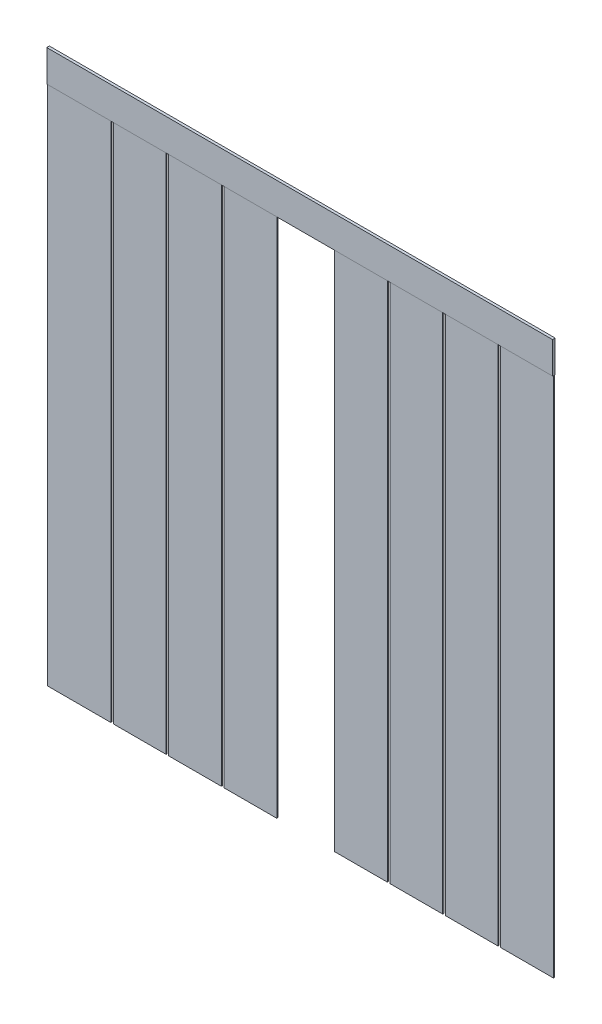
ISO-10303-21;
HEADER;
FILE_DESCRIPTION(('STEP AP214'),'2;1');
FILE_NAME('part.step','',(''),(''),'','','');
FILE_SCHEMA(('AUTOMOTIVE_DESIGN { 1 0 10303 214 1 1 1 1 }'));
ENDSEC;
DATA;
#1=APPLICATION_CONTEXT('core data for automotive mechanical design processes');
#2=APPLICATION_PROTOCOL_DEFINITION('international standard','automotive_design',2000,#1);
#3=PRODUCT_CONTEXT('',#1,'mechanical');
#4=PRODUCT('Part','Part','',(#3));
#5=PRODUCT_RELATED_PRODUCT_CATEGORY('part','',(#4));
#6=PRODUCT_DEFINITION_FORMATION('','',#4);
#7=PRODUCT_DEFINITION_CONTEXT('part definition',#1,'design');
#8=PRODUCT_DEFINITION('design','',#6,#7);
#9=PRODUCT_DEFINITION_SHAPE('','',#8);
#10=(LENGTH_UNIT() NAMED_UNIT(*) SI_UNIT(.MILLI.,.METRE.));
#11=(NAMED_UNIT(*) PLANE_ANGLE_UNIT() SI_UNIT($,.RADIAN.));
#12=(NAMED_UNIT(*) SI_UNIT($,.STERADIAN.) SOLID_ANGLE_UNIT());
#13=UNCERTAINTY_MEASURE_WITH_UNIT(LENGTH_MEASURE(1.E-05),#10,'distance_accuracy_value','');
#14=(GEOMETRIC_REPRESENTATION_CONTEXT(3) GLOBAL_UNCERTAINTY_ASSIGNED_CONTEXT((#13)) GLOBAL_UNIT_ASSIGNED_CONTEXT((#10,
#11,#12)) REPRESENTATION_CONTEXT('',''));
#15=CARTESIAN_POINT('',(0.,0.,0.));
#16=DIRECTION('',(0.,0.,1.));
#17=DIRECTION('',(1.,0.,0.));
#18=AXIS2_PLACEMENT_3D('',#15,#16,#17);
#19=CARTESIAN_POINT('',(2.57175827820944E-13,-2100.,10.));
#20=DIRECTION('',(0.,1.,0.));
#21=DIRECTION('',(0.,0.,1.));
#22=AXIS2_PLACEMENT_3D('',#19,#20,#21);
#23=PLANE('',#22);
#24=DIRECTION('',(1.,0.,0.));
#25=VECTOR('',#24,1.);
#26=CARTESIAN_POINT('',(2.57175827820944E-13,-2100.,7.));
#27=LINE('',#26,#25);
#28=CARTESIAN_POINT('',(1300.,-2100.,7.));
#29=VERTEX_POINT('',#28);
#30=CARTESIAN_POINT('',(1500.,-2100.,7.));
#31=VERTEX_POINT('',#30);
#32=EDGE_CURVE('E287',#29,#31,#27,.T.);
#33=ORIENTED_EDGE('',*,*,#32,.F.);
#34=DIRECTION('',(0.,0.,-1.));
#35=VECTOR('',#34,1.);
#36=CARTESIAN_POINT('',(1300.,-2100.,11.));
#37=LINE('',#36,#35);
#38=CARTESIAN_POINT('',(1300.,-2100.,3.));
#39=VERTEX_POINT('',#38);
#40=EDGE_CURVE('E272',#29,#39,#37,.T.);
#41=ORIENTED_EDGE('',*,*,#40,.T.);
#42=DIRECTION('',(-1.,0.,0.));
#43=VECTOR('',#42,1.);
#44=CARTESIAN_POINT('',(1920.,-2100.,3.));
#45=LINE('',#44,#43);
#46=CARTESIAN_POINT('',(1500.,-2100.,3.));
#47=VERTEX_POINT('',#46);
#48=EDGE_CURVE('E286',#47,#39,#45,.T.);
#49=ORIENTED_EDGE('',*,*,#48,.F.);
#50=DIRECTION('',(0.,0.,-1.));
#51=VECTOR('',#50,1.);
#52=CARTESIAN_POINT('',(1500.,-2100.,11.));
#53=LINE('',#52,#51);
#54=EDGE_CURVE('E489',#31,#47,#53,.T.);
#55=ORIENTED_EDGE('',*,*,#54,.F.);
#56=EDGE_LOOP('',(#33,#41,#49,#55));
#57=FACE_BOUND('',#56,.T.);
#58=ADVANCED_FACE('F35',(#57),#23,.F.);
#59=CARTESIAN_POINT('',(1290.,-2100.,3.));
#60=VERTEX_POINT('',#59);
#61=CARTESIAN_POINT('',(1090.,-2100.,3.));
#62=VERTEX_POINT('',#61);
#63=EDGE_CURVE('E295',#60,#62,#45,.T.);
#64=ORIENTED_EDGE('',*,*,#63,.F.);
#65=DIRECTION('',(0.,0.,-1.));
#66=VECTOR('',#65,1.);
#67=CARTESIAN_POINT('',(1290.,-2100.,11.));
#68=LINE('',#67,#66);
#69=CARTESIAN_POINT('',(1290.,-2100.,7.));
#70=VERTEX_POINT('',#69);
#71=EDGE_CURVE('E288',#70,#60,#68,.T.);
#72=ORIENTED_EDGE('',*,*,#71,.F.);
#73=CARTESIAN_POINT('',(1090.,-2100.,7.));
#74=VERTEX_POINT('',#73);
#75=EDGE_CURVE('E652',#74,#70,#27,.T.);
#76=ORIENTED_EDGE('',*,*,#75,.F.);
#77=DIRECTION('',(0.,0.,-1.));
#78=VECTOR('',#77,1.);
#79=CARTESIAN_POINT('',(1090.,-2100.,11.));
#80=LINE('',#79,#78);
#81=EDGE_CURVE('E558',#74,#62,#80,.T.);
#82=ORIENTED_EDGE('',*,*,#81,.T.);
#83=EDGE_LOOP('',(#64,#72,#76,#82));
#84=FACE_BOUND('',#83,.T.);
#85=ADVANCED_FACE('F614',(#84),#23,.F.);
#86=CARTESIAN_POINT('',(870.,-2100.,3.));
#87=VERTEX_POINT('',#86);
#88=CARTESIAN_POINT('',(670.,-2100.,3.));
#89=VERTEX_POINT('',#88);
#90=EDGE_CURVE('E300',#87,#89,#45,.T.);
#91=ORIENTED_EDGE('',*,*,#90,.F.);
#92=DIRECTION('',(0.,0.,-1.));
#93=VECTOR('',#92,1.);
#94=CARTESIAN_POINT('',(870.,-2100.,11.));
#95=LINE('',#94,#93);
#96=CARTESIAN_POINT('',(870.,-2100.,7.));
#97=VERTEX_POINT('',#96);
#98=EDGE_CURVE('E412',#97,#87,#95,.T.);
#99=ORIENTED_EDGE('',*,*,#98,.F.);
#100=CARTESIAN_POINT('',(670.,-2100.,7.));
#101=VERTEX_POINT('',#100);
#102=EDGE_CURVE('E415',#101,#97,#27,.T.);
#103=ORIENTED_EDGE('',*,*,#102,.F.);
#104=DIRECTION('',(0.,0.,-1.));
#105=VECTOR('',#104,1.);
#106=CARTESIAN_POINT('',(670.,-2100.,11.));
#107=LINE('',#106,#105);
#108=EDGE_CURVE('E414',#101,#89,#107,.T.);
#109=ORIENTED_EDGE('',*,*,#108,.T.);
#110=EDGE_LOOP('',(#91,#99,#103,#109));
#111=FACE_BOUND('',#110,.T.);
#112=ADVANCED_FACE('F410',(#111),#23,.F.);
#113=CARTESIAN_POINT('',(660.,-2100.,3.));
#114=VERTEX_POINT('',#113);
#115=CARTESIAN_POINT('',(460.,-2100.,3.));
#116=VERTEX_POINT('',#115);
#117=EDGE_CURVE('E387',#114,#116,#45,.T.);
#118=ORIENTED_EDGE('',*,*,#117,.F.);
#119=DIRECTION('',(0.,0.,-1.));
#120=VECTOR('',#119,1.);
#121=CARTESIAN_POINT('',(660.,-2100.,11.));
#122=LINE('',#121,#120);
#123=CARTESIAN_POINT('',(660.,-2100.,7.));
#124=VERTEX_POINT('',#123);
#125=EDGE_CURVE('E418',#124,#114,#122,.T.);
#126=ORIENTED_EDGE('',*,*,#125,.F.);
#127=CARTESIAN_POINT('',(460.,-2100.,7.));
#128=VERTEX_POINT('',#127);
#129=EDGE_CURVE('E582',#128,#124,#27,.T.);
#130=ORIENTED_EDGE('',*,*,#129,.F.);
#131=DIRECTION('',(0.,0.,-1.));
#132=VECTOR('',#131,1.);
#133=CARTESIAN_POINT('',(460.,-2100.,11.));
#134=LINE('',#133,#132);
#135=EDGE_CURVE('E432',#128,#116,#134,.T.);
#136=ORIENTED_EDGE('',*,*,#135,.T.);
#137=EDGE_LOOP('',(#118,#126,#130,#136));
#138=FACE_BOUND('',#137,.T.);
#139=ADVANCED_FACE('F579',(#138),#23,.F.);
#140=CARTESIAN_POINT('',(450.,-2100.,3.));
#141=VERTEX_POINT('',#140);
#142=CARTESIAN_POINT('',(250.,-2100.,3.));
#143=VERTEX_POINT('',#142);
#144=EDGE_CURVE('E382',#141,#143,#45,.T.);
#145=ORIENTED_EDGE('',*,*,#144,.F.);
#146=DIRECTION('',(0.,0.,-1.));
#147=VECTOR('',#146,1.);
#148=CARTESIAN_POINT('',(450.,-2100.,11.));
#149=LINE('',#148,#147);
#150=CARTESIAN_POINT('',(450.,-2100.,7.));
#151=VERTEX_POINT('',#150);
#152=EDGE_CURVE('E58',#151,#141,#149,.T.);
#153=ORIENTED_EDGE('',*,*,#152,.F.);
#154=CARTESIAN_POINT('',(250.,-2100.,7.));
#155=VERTEX_POINT('',#154);
#156=EDGE_CURVE('E331',#155,#151,#27,.T.);
#157=ORIENTED_EDGE('',*,*,#156,.F.);
#158=DIRECTION('',(0.,0.,-1.));
#159=VECTOR('',#158,1.);
#160=CARTESIAN_POINT('',(250.,-2100.,11.));
#161=LINE('',#160,#159);
#162=EDGE_CURVE('E444',#155,#143,#161,.T.);
#163=ORIENTED_EDGE('',*,*,#162,.T.);
#164=EDGE_LOOP('',(#145,#153,#157,#163));
#165=FACE_BOUND('',#164,.T.);
#166=ADVANCED_FACE('F628',(#165),#23,.F.);
#167=CARTESIAN_POINT('',(0.,0.,7.));
#168=DIRECTION('',(0.,0.,-1.));
#169=DIRECTION('',(-1.,0.,0.));
#170=AXIS2_PLACEMENT_3D('',#167,#168,#169);
#171=PLANE('',#170);
#172=DIRECTION('',(-1.,0.,0.));
#173=VECTOR('',#172,1.);
#174=CARTESIAN_POINT('',(0.,-120.,7.));
#175=LINE('',#174,#173);
#176=CARTESIAN_POINT('',(1500.,-120.,7.));
#177=VERTEX_POINT('',#176);
#178=CARTESIAN_POINT('',(1300.,-120.,7.));
#179=VERTEX_POINT('',#178);
#180=EDGE_CURVE('E1040',#177,#179,#175,.T.);
#181=ORIENTED_EDGE('',*,*,#180,.T.);
#182=DIRECTION('',(0.,-1.,0.));
#183=VECTOR('',#182,1.);
#184=CARTESIAN_POINT('',(1300.,0.,7.));
#185=LINE('',#184,#183);
#186=EDGE_CURVE('E477',#179,#29,#185,.T.);
#187=ORIENTED_EDGE('',*,*,#186,.T.);
#188=ORIENTED_EDGE('',*,*,#32,.T.);
#189=DIRECTION('',(0.,1.,0.));
#190=VECTOR('',#189,1.);
#191=CARTESIAN_POINT('',(1500.,0.,7.));
#192=LINE('',#191,#190);
#193=EDGE_CURVE('E485',#31,#177,#192,.T.);
#194=ORIENTED_EDGE('',*,*,#193,.T.);
#195=EDGE_LOOP('',(#181,#187,#188,#194));
#196=FACE_BOUND('',#195,.T.);
#197=ADVANCED_FACE('F637',(#196),#171,.F.);
#198=ORIENTED_EDGE('',*,*,#75,.T.);
#199=DIRECTION('',(0.,1.,0.));
#200=VECTOR('',#199,1.);
#201=CARTESIAN_POINT('',(1290.,0.,7.));
#202=LINE('',#201,#200);
#203=CARTESIAN_POINT('',(1290.,-120.,7.));
#204=VERTEX_POINT('',#203);
#205=EDGE_CURVE('E474',#70,#204,#202,.T.);
#206=ORIENTED_EDGE('',*,*,#205,.T.);
#207=CARTESIAN_POINT('',(1090.,-120.,7.));
#208=VERTEX_POINT('',#207);
#209=EDGE_CURVE('E548',#204,#208,#175,.T.);
#210=ORIENTED_EDGE('',*,*,#209,.T.);
#211=DIRECTION('',(0.,-1.,0.));
#212=VECTOR('',#211,1.);
#213=CARTESIAN_POINT('',(1090.,0.,7.));
#214=LINE('',#213,#212);
#215=EDGE_CURVE('E471',#208,#74,#214,.T.);
#216=ORIENTED_EDGE('',*,*,#215,.T.);
#217=EDGE_LOOP('',(#198,#206,#210,#216));
#218=FACE_BOUND('',#217,.T.);
#219=ADVANCED_FACE('F643',(#218),#171,.F.);
#220=ORIENTED_EDGE('',*,*,#102,.T.);
#221=DIRECTION('',(0.,1.,0.));
#222=VECTOR('',#221,1.);
#223=CARTESIAN_POINT('',(870.,0.,7.));
#224=LINE('',#223,#222);
#225=CARTESIAN_POINT('',(870.,-120.,7.));
#226=VERTEX_POINT('',#225);
#227=EDGE_CURVE('E468',#97,#226,#224,.T.);
#228=ORIENTED_EDGE('',*,*,#227,.T.);
#229=CARTESIAN_POINT('',(670.,-120.,7.));
#230=VERTEX_POINT('',#229);
#231=EDGE_CURVE('E587',#226,#230,#175,.T.);
#232=ORIENTED_EDGE('',*,*,#231,.T.);
#233=DIRECTION('',(0.,-1.,0.));
#234=VECTOR('',#233,1.);
#235=CARTESIAN_POINT('',(670.,0.,7.));
#236=LINE('',#235,#234);
#237=EDGE_CURVE('E466',#230,#101,#236,.T.);
#238=ORIENTED_EDGE('',*,*,#237,.T.);
#239=EDGE_LOOP('',(#220,#228,#232,#238));
#240=FACE_BOUND('',#239,.T.);
#241=ADVANCED_FACE('F658',(#240),#171,.F.);
#242=ORIENTED_EDGE('',*,*,#129,.T.);
#243=DIRECTION('',(0.,1.,0.));
#244=VECTOR('',#243,1.);
#245=CARTESIAN_POINT('',(660.,0.,7.));
#246=LINE('',#245,#244);
#247=CARTESIAN_POINT('',(660.,-120.,7.));
#248=VERTEX_POINT('',#247);
#249=EDGE_CURVE('E463',#124,#248,#246,.T.);
#250=ORIENTED_EDGE('',*,*,#249,.T.);
#251=CARTESIAN_POINT('',(460.,-120.,7.));
#252=VERTEX_POINT('',#251);
#253=EDGE_CURVE('E573',#248,#252,#175,.T.);
#254=ORIENTED_EDGE('',*,*,#253,.T.);
#255=DIRECTION('',(0.,-1.,0.));
#256=VECTOR('',#255,1.);
#257=CARTESIAN_POINT('',(460.,0.,7.));
#258=LINE('',#257,#256);
#259=EDGE_CURVE('E460',#252,#128,#258,.T.);
#260=ORIENTED_EDGE('',*,*,#259,.T.);
#261=EDGE_LOOP('',(#242,#250,#254,#260));
#262=FACE_BOUND('',#261,.T.);
#263=ADVANCED_FACE('F586',(#262),#171,.F.);
#264=ORIENTED_EDGE('',*,*,#156,.T.);
#265=DIRECTION('',(0.,1.,0.));
#266=VECTOR('',#265,1.);
#267=CARTESIAN_POINT('',(450.,0.,7.));
#268=LINE('',#267,#266);
#269=CARTESIAN_POINT('',(450.,-120.,7.));
#270=VERTEX_POINT('',#269);
#271=EDGE_CURVE('E457',#151,#270,#268,.T.);
#272=ORIENTED_EDGE('',*,*,#271,.T.);
#273=CARTESIAN_POINT('',(250.,-120.,7.));
#274=VERTEX_POINT('',#273);
#275=EDGE_CURVE('E588',#270,#274,#175,.T.);
#276=ORIENTED_EDGE('',*,*,#275,.T.);
#277=DIRECTION('',(0.,-1.,0.));
#278=VECTOR('',#277,1.);
#279=CARTESIAN_POINT('',(250.,0.,7.));
#280=LINE('',#279,#278);
#281=EDGE_CURVE('E454',#274,#155,#280,.T.);
#282=ORIENTED_EDGE('',*,*,#281,.T.);
#283=EDGE_LOOP('',(#264,#272,#276,#282));
#284=FACE_BOUND('',#283,.T.);
#285=ADVANCED_FACE('F634',(#284),#171,.F.);
#286=CARTESIAN_POINT('',(0.,0.,3.));
#287=DIRECTION('',(0.,0.,1.));
#288=DIRECTION('',(1.,0.,0.));
#289=AXIS2_PLACEMENT_3D('',#286,#287,#288);
#290=PLANE('',#289);
#291=ORIENTED_EDGE('',*,*,#48,.T.);
#292=DIRECTION('',(0.,-1.,0.));
#293=VECTOR('',#292,1.);
#294=CARTESIAN_POINT('',(1300.,-2100.,3.));
#295=LINE('',#294,#293);
#296=CARTESIAN_POINT('',(1300.,-120.,3.));
#297=VERTEX_POINT('',#296);
#298=EDGE_CURVE('E269',#297,#39,#295,.T.);
#299=ORIENTED_EDGE('',*,*,#298,.F.);
#300=DIRECTION('',(1.,0.,0.));
#301=VECTOR('',#300,1.);
#302=CARTESIAN_POINT('',(1920.,-120.,3.));
#303=LINE('',#302,#301);
#304=CARTESIAN_POINT('',(1500.,-120.,3.));
#305=VERTEX_POINT('',#304);
#306=EDGE_CURVE('E315',#297,#305,#303,.T.);
#307=ORIENTED_EDGE('',*,*,#306,.T.);
#308=DIRECTION('',(0.,1.,0.));
#309=VECTOR('',#308,1.);
#310=CARTESIAN_POINT('',(1500.,-2100.,3.));
#311=LINE('',#310,#309);
#312=EDGE_CURVE('E293',#47,#305,#311,.T.);
#313=ORIENTED_EDGE('',*,*,#312,.F.);
#314=EDGE_LOOP('',(#291,#299,#307,#313));
#315=FACE_BOUND('',#314,.T.);
#316=ADVANCED_FACE('F291',(#315),#290,.F.);
#317=CARTESIAN_POINT('',(1090.,-120.,3.));
#318=VERTEX_POINT('',#317);
#319=CARTESIAN_POINT('',(1290.,-120.,3.));
#320=VERTEX_POINT('',#319);
#321=EDGE_CURVE('E527',#318,#320,#303,.T.);
#322=ORIENTED_EDGE('',*,*,#321,.T.);
#323=DIRECTION('',(0.,1.,0.));
#324=VECTOR('',#323,1.);
#325=CARTESIAN_POINT('',(1290.,-2100.,3.));
#326=LINE('',#325,#324);
#327=EDGE_CURVE('E279',#60,#320,#326,.T.);
#328=ORIENTED_EDGE('',*,*,#327,.F.);
#329=ORIENTED_EDGE('',*,*,#63,.T.);
#330=DIRECTION('',(0.,-1.,0.));
#331=VECTOR('',#330,1.);
#332=CARTESIAN_POINT('',(1090.,-2100.,3.));
#333=LINE('',#332,#331);
#334=EDGE_CURVE('E542',#318,#62,#333,.T.);
#335=ORIENTED_EDGE('',*,*,#334,.F.);
#336=EDGE_LOOP('',(#322,#328,#329,#335));
#337=FACE_BOUND('',#336,.T.);
#338=ADVANCED_FACE('F539',(#337),#290,.F.);
#339=CARTESIAN_POINT('',(670.,-120.,3.));
#340=VERTEX_POINT('',#339);
#341=CARTESIAN_POINT('',(870.,-120.,3.));
#342=VERTEX_POINT('',#341);
#343=EDGE_CURVE('E532',#340,#342,#303,.T.);
#344=ORIENTED_EDGE('',*,*,#343,.T.);
#345=DIRECTION('',(0.,1.,0.));
#346=VECTOR('',#345,1.);
#347=CARTESIAN_POINT('',(870.,-2100.,3.));
#348=LINE('',#347,#346);
#349=EDGE_CURVE('E406',#87,#342,#348,.T.);
#350=ORIENTED_EDGE('',*,*,#349,.F.);
#351=ORIENTED_EDGE('',*,*,#90,.T.);
#352=DIRECTION('',(0.,-1.,0.));
#353=VECTOR('',#352,1.);
#354=CARTESIAN_POINT('',(670.,-2100.,3.));
#355=LINE('',#354,#353);
#356=EDGE_CURVE('E403',#340,#89,#355,.T.);
#357=ORIENTED_EDGE('',*,*,#356,.F.);
#358=EDGE_LOOP('',(#344,#350,#351,#357));
#359=FACE_BOUND('',#358,.T.);
#360=ADVANCED_FACE('F402',(#359),#290,.F.);
#361=CARTESIAN_POINT('',(460.,-120.,3.));
#362=VERTEX_POINT('',#361);
#363=CARTESIAN_POINT('',(660.,-120.,3.));
#364=VERTEX_POINT('',#363);
#365=EDGE_CURVE('E529',#362,#364,#303,.T.);
#366=ORIENTED_EDGE('',*,*,#365,.T.);
#367=DIRECTION('',(0.,1.,0.));
#368=VECTOR('',#367,1.);
#369=CARTESIAN_POINT('',(660.,-2100.,3.));
#370=LINE('',#369,#368);
#371=EDGE_CURVE('E419',#114,#364,#370,.T.);
#372=ORIENTED_EDGE('',*,*,#371,.F.);
#373=ORIENTED_EDGE('',*,*,#117,.T.);
#374=DIRECTION('',(0.,-1.,0.));
#375=VECTOR('',#374,1.);
#376=CARTESIAN_POINT('',(460.,-2100.,3.));
#377=LINE('',#376,#375);
#378=EDGE_CURVE('E427',#362,#116,#377,.T.);
#379=ORIENTED_EDGE('',*,*,#378,.F.);
#380=EDGE_LOOP('',(#366,#372,#373,#379));
#381=FACE_BOUND('',#380,.T.);
#382=ADVANCED_FACE('F577',(#381),#290,.F.);
#383=CARTESIAN_POINT('',(250.,-120.,3.));
#384=VERTEX_POINT('',#383);
#385=CARTESIAN_POINT('',(450.,-120.,3.));
#386=VERTEX_POINT('',#385);
#387=EDGE_CURVE('E314',#384,#386,#303,.T.);
#388=ORIENTED_EDGE('',*,*,#387,.T.);
#389=DIRECTION('',(0.,1.,0.));
#390=VECTOR('',#389,1.);
#391=CARTESIAN_POINT('',(450.,-2100.,3.));
#392=LINE('',#391,#390);
#393=EDGE_CURVE('E429',#141,#386,#392,.T.);
#394=ORIENTED_EDGE('',*,*,#393,.F.);
#395=ORIENTED_EDGE('',*,*,#144,.T.);
#396=DIRECTION('',(0.,-1.,0.));
#397=VECTOR('',#396,1.);
#398=CARTESIAN_POINT('',(250.,-2100.,3.));
#399=LINE('',#398,#397);
#400=EDGE_CURVE('E440',#384,#143,#399,.T.);
#401=ORIENTED_EDGE('',*,*,#400,.F.);
#402=EDGE_LOOP('',(#388,#394,#395,#401));
#403=FACE_BOUND('',#402,.T.);
#404=ADVANCED_FACE('F625',(#403),#290,.F.);
#405=CARTESIAN_POINT('',(1510.,-2100.,7.));
#406=VERTEX_POINT('',#405);
#407=CARTESIAN_POINT('',(1710.,-2100.,7.));
#408=VERTEX_POINT('',#407);
#409=EDGE_CURVE('E650',#406,#408,#27,.T.);
#410=ORIENTED_EDGE('',*,*,#409,.F.);
#411=DIRECTION('',(0.,0.,-1.));
#412=VECTOR('',#411,1.);
#413=CARTESIAN_POINT('',(1510.,-2100.,11.));
#414=LINE('',#413,#412);
#415=CARTESIAN_POINT('',(1510.,-2100.,3.));
#416=VERTEX_POINT('',#415);
#417=EDGE_CURVE('E482',#406,#416,#414,.T.);
#418=ORIENTED_EDGE('',*,*,#417,.T.);
#419=CARTESIAN_POINT('',(1710.,-2100.,3.));
#420=VERTEX_POINT('',#419);
#421=EDGE_CURVE('E294',#420,#416,#45,.T.);
#422=ORIENTED_EDGE('',*,*,#421,.F.);
#423=DIRECTION('',(0.,0.,-1.));
#424=VECTOR('',#423,1.);
#425=CARTESIAN_POINT('',(1710.,-2100.,11.));
#426=LINE('',#425,#424);
#427=EDGE_CURVE('E508',#408,#420,#426,.T.);
#428=ORIENTED_EDGE('',*,*,#427,.F.);
#429=EDGE_LOOP('',(#410,#418,#422,#428));
#430=FACE_BOUND('',#429,.T.);
#431=ADVANCED_FACE('F617',(#430),#23,.F.);
#432=CARTESIAN_POINT('',(1710.,-120.,7.));
#433=VERTEX_POINT('',#432);
#434=CARTESIAN_POINT('',(1510.,-120.,7.));
#435=VERTEX_POINT('',#434);
#436=EDGE_CURVE('E338',#433,#435,#175,.T.);
#437=ORIENTED_EDGE('',*,*,#436,.T.);
#438=DIRECTION('',(0.,-1.,0.));
#439=VECTOR('',#438,1.);
#440=CARTESIAN_POINT('',(1510.,0.,7.));
#441=LINE('',#440,#439);
#442=EDGE_CURVE('E495',#435,#406,#441,.T.);
#443=ORIENTED_EDGE('',*,*,#442,.T.);
#444=ORIENTED_EDGE('',*,*,#409,.T.);
#445=DIRECTION('',(0.,1.,0.));
#446=VECTOR('',#445,1.);
#447=CARTESIAN_POINT('',(1710.,0.,7.));
#448=LINE('',#447,#446);
#449=EDGE_CURVE('E504',#408,#433,#448,.T.);
#450=ORIENTED_EDGE('',*,*,#449,.T.);
#451=EDGE_LOOP('',(#437,#443,#444,#450));
#452=FACE_BOUND('',#451,.T.);
#453=ADVANCED_FACE('F623',(#452),#171,.F.);
#454=ORIENTED_EDGE('',*,*,#421,.T.);
#455=DIRECTION('',(0.,-1.,0.));
#456=VECTOR('',#455,1.);
#457=CARTESIAN_POINT('',(1510.,-2100.,3.));
#458=LINE('',#457,#456);
#459=CARTESIAN_POINT('',(1510.,-120.,3.));
#460=VERTEX_POINT('',#459);
#461=EDGE_CURVE('E479',#460,#416,#458,.T.);
#462=ORIENTED_EDGE('',*,*,#461,.F.);
#463=CARTESIAN_POINT('',(1710.,-120.,3.));
#464=VERTEX_POINT('',#463);
#465=EDGE_CURVE('E522',#460,#464,#303,.T.);
#466=ORIENTED_EDGE('',*,*,#465,.T.);
#467=DIRECTION('',(0.,1.,0.));
#468=VECTOR('',#467,1.);
#469=CARTESIAN_POINT('',(1710.,-2100.,3.));
#470=LINE('',#469,#468);
#471=EDGE_CURVE('E499',#420,#464,#470,.T.);
#472=ORIENTED_EDGE('',*,*,#471,.F.);
#473=EDGE_LOOP('',(#454,#462,#466,#472));
#474=FACE_BOUND('',#473,.T.);
#475=ADVANCED_FACE('F616',(#474),#290,.F.);
#476=CARTESIAN_POINT('',(1720.,-2100.,7.));
#477=VERTEX_POINT('',#476);
#478=CARTESIAN_POINT('',(1920.,-2100.,7.));
#479=VERTEX_POINT('',#478);
#480=EDGE_CURVE('E326',#477,#479,#27,.T.);
#481=ORIENTED_EDGE('',*,*,#480,.F.);
#482=DIRECTION('',(0.,0.,-1.));
#483=VECTOR('',#482,1.);
#484=CARTESIAN_POINT('',(1720.,-2100.,11.));
#485=LINE('',#484,#483);
#486=CARTESIAN_POINT('',(1720.,-2100.,3.));
#487=VERTEX_POINT('',#486);
#488=EDGE_CURVE('E375',#477,#487,#485,.T.);
#489=ORIENTED_EDGE('',*,*,#488,.T.);
#490=CARTESIAN_POINT('',(1920.,-2100.,3.));
#491=VERTEX_POINT('',#490);
#492=EDGE_CURVE('E298',#491,#487,#45,.T.);
#493=ORIENTED_EDGE('',*,*,#492,.F.);
#494=DIRECTION('',(0.,0.,-1.));
#495=VECTOR('',#494,1.);
#496=CARTESIAN_POINT('',(1920.,-2100.,10.));
#497=LINE('',#496,#495);
#498=EDGE_CURVE('E43',#479,#491,#497,.T.);
#499=ORIENTED_EDGE('',*,*,#498,.F.);
#500=EDGE_LOOP('',(#481,#489,#493,#499));
#501=FACE_BOUND('',#500,.T.);
#502=ADVANCED_FACE('F373',(#501),#23,.F.);
#503=CARTESIAN_POINT('',(1920.,-120.,7.));
#504=VERTEX_POINT('',#503);
#505=CARTESIAN_POINT('',(1720.,-120.,7.));
#506=VERTEX_POINT('',#505);
#507=EDGE_CURVE('E334',#504,#506,#175,.T.);
#508=ORIENTED_EDGE('',*,*,#507,.T.);
#509=DIRECTION('',(0.,-1.,0.));
#510=VECTOR('',#509,1.);
#511=CARTESIAN_POINT('',(1720.,0.,7.));
#512=LINE('',#511,#510);
#513=EDGE_CURVE('E318',#506,#477,#512,.T.);
#514=ORIENTED_EDGE('',*,*,#513,.T.);
#515=ORIENTED_EDGE('',*,*,#480,.T.);
#516=DIRECTION('',(0.,1.,0.));
#517=VECTOR('',#516,1.);
#518=CARTESIAN_POINT('',(1920.,-2100.,7.));
#519=LINE('',#518,#517);
#520=EDGE_CURVE('E330',#479,#504,#519,.T.);
#521=ORIENTED_EDGE('',*,*,#520,.T.);
#522=EDGE_LOOP('',(#508,#514,#515,#521));
#523=FACE_BOUND('',#522,.T.);
#524=ADVANCED_FACE('F514',(#523),#171,.F.);
#525=ORIENTED_EDGE('',*,*,#492,.T.);
#526=DIRECTION('',(0.,-1.,0.));
#527=VECTOR('',#526,1.);
#528=CARTESIAN_POINT('',(1720.,-2100.,3.));
#529=LINE('',#528,#527);
#530=CARTESIAN_POINT('',(1720.,-120.,3.));
#531=VERTEX_POINT('',#530);
#532=EDGE_CURVE('E379',#531,#487,#529,.T.);
#533=ORIENTED_EDGE('',*,*,#532,.F.);
#534=CARTESIAN_POINT('',(1920.,-120.,3.));
#535=VERTEX_POINT('',#534);
#536=EDGE_CURVE('E309',#531,#535,#303,.T.);
#537=ORIENTED_EDGE('',*,*,#536,.T.);
#538=DIRECTION('',(0.,-1.,0.));
#539=VECTOR('',#538,1.);
#540=CARTESIAN_POINT('',(1920.,-2100.,3.));
#541=LINE('',#540,#539);
#542=EDGE_CURVE('E306',#535,#491,#541,.T.);
#543=ORIENTED_EDGE('',*,*,#542,.T.);
#544=EDGE_LOOP('',(#525,#533,#537,#543));
#545=FACE_BOUND('',#544,.T.);
#546=ADVANCED_FACE('F378',(#545),#290,.F.);
#547=CARTESIAN_POINT('',(0.,0.,10.));
#548=DIRECTION('',(1.,0.,0.));
#549=DIRECTION('',(0.,1.,0.));
#550=AXIS2_PLACEMENT_3D('',#547,#548,#549);
#551=PLANE('',#550);
#552=DIRECTION('',(0.,-1.,0.));
#553=VECTOR('',#552,1.);
#554=CARTESIAN_POINT('',(0.,0.,0.));
#555=LINE('',#554,#553);
#556=CARTESIAN_POINT('',(0.,0.,0.));
#557=VERTEX_POINT('',#556);
#558=CARTESIAN_POINT('',(0.,-120.,0.));
#559=VERTEX_POINT('',#558);
#560=EDGE_CURVE('E343',#557,#559,#555,.T.);
#561=ORIENTED_EDGE('',*,*,#560,.T.);
#562=DIRECTION('',(0.,0.,-1.));
#563=VECTOR('',#562,1.);
#564=CARTESIAN_POINT('',(0.,-120.,3.));
#565=LINE('',#564,#563);
#566=CARTESIAN_POINT('',(0.,-120.,3.));
#567=VERTEX_POINT('',#566);
#568=EDGE_CURVE('E313',#567,#559,#565,.T.);
#569=ORIENTED_EDGE('',*,*,#568,.F.);
#570=DIRECTION('',(0.,1.,0.));
#571=VECTOR('',#570,1.);
#572=CARTESIAN_POINT('',(0.,-2100.,3.));
#573=LINE('',#572,#571);
#574=CARTESIAN_POINT('',(0.,-2100.,3.));
#575=VERTEX_POINT('',#574);
#576=EDGE_CURVE('E304',#575,#567,#573,.T.);
#577=ORIENTED_EDGE('',*,*,#576,.F.);
#578=DIRECTION('',(0.,0.,-1.));
#579=VECTOR('',#578,1.);
#580=CARTESIAN_POINT('',(2.57175827820944E-13,-2100.,10.));
#581=LINE('',#580,#579);
#582=CARTESIAN_POINT('',(2.57175827820944E-13,-2100.,7.));
#583=VERTEX_POINT('',#582);
#584=EDGE_CURVE('E11',#583,#575,#581,.T.);
#585=ORIENTED_EDGE('',*,*,#584,.F.);
#586=DIRECTION('',(0.,-1.,0.));
#587=VECTOR('',#586,1.);
#588=CARTESIAN_POINT('',(2.57175827820944E-13,-2100.,7.));
#589=LINE('',#588,#587);
#590=CARTESIAN_POINT('',(0.,-120.,7.));
#591=VERTEX_POINT('',#590);
#592=EDGE_CURVE('E324',#591,#583,#589,.T.);
#593=ORIENTED_EDGE('',*,*,#592,.F.);
#594=DIRECTION('',(0.,0.,1.));
#595=VECTOR('',#594,1.);
#596=CARTESIAN_POINT('',(0.,-120.,7.));
#597=LINE('',#596,#595);
#598=CARTESIAN_POINT('',(0.,-120.,10.));
#599=VERTEX_POINT('',#598);
#600=EDGE_CURVE('E340',#591,#599,#597,.T.);
#601=ORIENTED_EDGE('',*,*,#600,.T.);
#602=DIRECTION('',(0.,-1.,0.));
#603=VECTOR('',#602,1.);
#604=CARTESIAN_POINT('',(0.,0.,10.));
#605=LINE('',#604,#603);
#606=CARTESIAN_POINT('',(0.,0.,10.));
#607=VERTEX_POINT('',#606);
#608=EDGE_CURVE('E345',#607,#599,#605,.T.);
#609=ORIENTED_EDGE('',*,*,#608,.F.);
#610=DIRECTION('',(0.,0.,-1.));
#611=VECTOR('',#610,1.);
#612=CARTESIAN_POINT('',(0.,0.,10.));
#613=LINE('',#612,#611);
#614=EDGE_CURVE('E353',#607,#557,#613,.T.);
#615=ORIENTED_EDGE('',*,*,#614,.T.);
#616=EDGE_LOOP('',(#561,#569,#577,#585,#593,#601,#609,#615));
#617=FACE_BOUND('',#616,.T.);
#618=ADVANCED_FACE('F37',(#617),#551,.F.);
#619=CARTESIAN_POINT('',(240.,-2100.,3.));
#620=VERTEX_POINT('',#619);
#621=EDGE_CURVE('E305',#620,#575,#45,.T.);
#622=ORIENTED_EDGE('',*,*,#621,.F.);
#623=DIRECTION('',(0.,0.,-1.));
#624=VECTOR('',#623,1.);
#625=CARTESIAN_POINT('',(240.,-2100.,11.));
#626=LINE('',#625,#624);
#627=CARTESIAN_POINT('',(240.,-2100.,7.));
#628=VERTEX_POINT('',#627);
#629=EDGE_CURVE('E50',#628,#620,#626,.T.);
#630=ORIENTED_EDGE('',*,*,#629,.F.);
#631=EDGE_CURVE('E327',#583,#628,#27,.T.);
#632=ORIENTED_EDGE('',*,*,#631,.F.);
#633=ORIENTED_EDGE('',*,*,#584,.T.);
#634=EDGE_LOOP('',(#622,#630,#632,#633));
#635=FACE_BOUND('',#634,.T.);
#636=ADVANCED_FACE('F605',(#635),#23,.F.);
#637=CARTESIAN_POINT('',(1920.,0.,10.));
#638=DIRECTION('',(-1.,0.,0.));
#639=DIRECTION('',(0.,0.,1.));
#640=AXIS2_PLACEMENT_3D('',#637,#638,#639);
#641=PLANE('',#640);
#642=ORIENTED_EDGE('',*,*,#542,.F.);
#643=DIRECTION('',(0.,0.,-1.));
#644=VECTOR('',#643,1.);
#645=CARTESIAN_POINT('',(1920.,-120.,3.));
#646=LINE('',#645,#644);
#647=CARTESIAN_POINT('',(1920.,-120.,0.));
#648=VERTEX_POINT('',#647);
#649=EDGE_CURVE('E319',#535,#648,#646,.T.);
#650=ORIENTED_EDGE('',*,*,#649,.T.);
#651=DIRECTION('',(0.,1.,0.));
#652=VECTOR('',#651,1.);
#653=CARTESIAN_POINT('',(1920.,0.,0.));
#654=LINE('',#653,#652);
#655=CARTESIAN_POINT('',(1920.,0.,0.));
#656=VERTEX_POINT('',#655);
#657=EDGE_CURVE('E356',#648,#656,#654,.T.);
#658=ORIENTED_EDGE('',*,*,#657,.T.);
#659=DIRECTION('',(0.,0.,-1.));
#660=VECTOR('',#659,1.);
#661=CARTESIAN_POINT('',(1920.,0.,10.));
#662=LINE('',#661,#660);
#663=CARTESIAN_POINT('',(1920.,0.,10.));
#664=VERTEX_POINT('',#663);
#665=EDGE_CURVE('E361',#664,#656,#662,.T.);
#666=ORIENTED_EDGE('',*,*,#665,.F.);
#667=DIRECTION('',(0.,1.,0.));
#668=VECTOR('',#667,1.);
#669=CARTESIAN_POINT('',(1920.,0.,10.));
#670=LINE('',#669,#668);
#671=CARTESIAN_POINT('',(1920.,-120.,10.));
#672=VERTEX_POINT('',#671);
#673=EDGE_CURVE('E348',#672,#664,#670,.T.);
#674=ORIENTED_EDGE('',*,*,#673,.F.);
#675=DIRECTION('',(0.,0.,1.));
#676=VECTOR('',#675,1.);
#677=CARTESIAN_POINT('',(1920.,-120.,7.));
#678=LINE('',#677,#676);
#679=EDGE_CURVE('E337',#504,#672,#678,.T.);
#680=ORIENTED_EDGE('',*,*,#679,.F.);
#681=ORIENTED_EDGE('',*,*,#520,.F.);
#682=ORIENTED_EDGE('',*,*,#498,.T.);
#683=EDGE_LOOP('',(#642,#650,#658,#666,#674,#680,#681,#682));
#684=FACE_BOUND('',#683,.T.);
#685=ADVANCED_FACE('F368',(#684),#641,.F.);
#686=CARTESIAN_POINT('',(0.,0.,10.));
#687=DIRECTION('',(0.,-1.,0.));
#688=DIRECTION('',(0.,0.,-1.));
#689=AXIS2_PLACEMENT_3D('',#686,#687,#688);
#690=PLANE('',#689);
#691=DIRECTION('',(-1.,0.,0.));
#692=VECTOR('',#691,1.);
#693=CARTESIAN_POINT('',(0.,0.,0.));
#694=LINE('',#693,#692);
#695=EDGE_CURVE('E349',#656,#557,#694,.T.);
#696=ORIENTED_EDGE('',*,*,#695,.T.);
#697=ORIENTED_EDGE('',*,*,#614,.F.);
#698=DIRECTION('',(-1.,0.,0.));
#699=VECTOR('',#698,1.);
#700=CARTESIAN_POINT('',(0.,0.,10.));
#701=LINE('',#700,#699);
#702=EDGE_CURVE('E351',#664,#607,#701,.T.);
#703=ORIENTED_EDGE('',*,*,#702,.F.);
#704=ORIENTED_EDGE('',*,*,#665,.T.);
#705=EDGE_LOOP('',(#696,#697,#703,#704));
#706=FACE_BOUND('',#705,.T.);
#707=ADVANCED_FACE('F611',(#706),#690,.F.);
#708=CARTESIAN_POINT('',(0.,0.,10.));
#709=DIRECTION('',(0.,0.,1.));
#710=DIRECTION('',(1.,0.,0.));
#711=AXIS2_PLACEMENT_3D('',#708,#709,#710);
#712=PLANE('',#711);
#713=DIRECTION('',(-1.,0.,0.));
#714=VECTOR('',#713,1.);
#715=CARTESIAN_POINT('',(0.,-120.,10.));
#716=LINE('',#715,#714);
#717=EDGE_CURVE('E322',#672,#599,#716,.T.);
#718=ORIENTED_EDGE('',*,*,#717,.F.);
#719=ORIENTED_EDGE('',*,*,#673,.T.);
#720=ORIENTED_EDGE('',*,*,#702,.T.);
#721=ORIENTED_EDGE('',*,*,#608,.T.);
#722=EDGE_LOOP('',(#718,#719,#720,#721));
#723=FACE_BOUND('',#722,.T.);
#724=ADVANCED_FACE('F709',(#723),#712,.T.);
#725=CARTESIAN_POINT('',(0.,0.,0.));
#726=DIRECTION('',(0.,0.,1.));
#727=DIRECTION('',(1.,0.,0.));
#728=AXIS2_PLACEMENT_3D('',#725,#726,#727);
#729=PLANE('',#728);
#730=ORIENTED_EDGE('',*,*,#657,.F.);
#731=DIRECTION('',(1.,0.,0.));
#732=VECTOR('',#731,1.);
#733=CARTESIAN_POINT('',(1920.,-120.,0.));
#734=LINE('',#733,#732);
#735=EDGE_CURVE('E316',#559,#648,#734,.T.);
#736=ORIENTED_EDGE('',*,*,#735,.F.);
#737=ORIENTED_EDGE('',*,*,#560,.F.);
#738=ORIENTED_EDGE('',*,*,#695,.F.);
#739=EDGE_LOOP('',(#730,#736,#737,#738));
#740=FACE_BOUND('',#739,.T.);
#741=ADVANCED_FACE('F707',(#740),#729,.F.);
#742=CARTESIAN_POINT('',(0.,-120.,7.));
#743=DIRECTION('',(0.,1.,0.));
#744=DIRECTION('',(0.,0.,1.));
#745=AXIS2_PLACEMENT_3D('',#742,#743,#744);
#746=PLANE('',#745);
#747=DIRECTION('',(0.,0.,-1.));
#748=VECTOR('',#747,1.);
#749=CARTESIAN_POINT('',(1300.,-120.,11.));
#750=LINE('',#749,#748);
#751=EDGE_CURVE('E275',#179,#297,#750,.T.);
#752=ORIENTED_EDGE('',*,*,#751,.F.);
#753=ORIENTED_EDGE('',*,*,#180,.F.);
#754=DIRECTION('',(0.,0.,-1.));
#755=VECTOR('',#754,1.);
#756=CARTESIAN_POINT('',(1500.,-120.,11.));
#757=LINE('',#756,#755);
#758=EDGE_CURVE('E486',#177,#305,#757,.T.);
#759=ORIENTED_EDGE('',*,*,#758,.T.);
#760=ORIENTED_EDGE('',*,*,#306,.F.);
#761=EDGE_LOOP('',(#752,#753,#759,#760));
#762=FACE_BOUND('',#761,.T.);
#763=ORIENTED_EDGE('',*,*,#209,.F.);
#764=DIRECTION('',(0.,0.,-1.));
#765=VECTOR('',#764,1.);
#766=CARTESIAN_POINT('',(1290.,-120.,11.));
#767=LINE('',#766,#765);
#768=EDGE_CURVE('E547',#204,#320,#767,.T.);
#769=ORIENTED_EDGE('',*,*,#768,.T.);
#770=ORIENTED_EDGE('',*,*,#321,.F.);
#771=DIRECTION('',(0.,0.,-1.));
#772=VECTOR('',#771,1.);
#773=CARTESIAN_POINT('',(1090.,-120.,11.));
#774=LINE('',#773,#772);
#775=EDGE_CURVE('E280',#208,#318,#774,.T.);
#776=ORIENTED_EDGE('',*,*,#775,.F.);
#777=EDGE_LOOP('',(#763,#769,#770,#776));
#778=FACE_BOUND('',#777,.T.);
#779=ORIENTED_EDGE('',*,*,#717,.T.);
#780=ORIENTED_EDGE('',*,*,#600,.F.);
#781=CARTESIAN_POINT('',(240.,-120.,7.));
#782=VERTEX_POINT('',#781);
#783=EDGE_CURVE('E333',#782,#591,#175,.T.);
#784=ORIENTED_EDGE('',*,*,#783,.F.);
#785=DIRECTION('',(0.,0.,-1.));
#786=VECTOR('',#785,1.);
#787=CARTESIAN_POINT('',(240.,-120.,11.));
#788=LINE('',#787,#786);
#789=CARTESIAN_POINT('',(240.,-120.,3.));
#790=VERTEX_POINT('',#789);
#791=EDGE_CURVE('E446',#782,#790,#788,.T.);
#792=ORIENTED_EDGE('',*,*,#791,.T.);
#793=EDGE_CURVE('E310',#567,#790,#303,.T.);
#794=ORIENTED_EDGE('',*,*,#793,.F.);
#795=ORIENTED_EDGE('',*,*,#568,.T.);
#796=ORIENTED_EDGE('',*,*,#735,.T.);
#797=ORIENTED_EDGE('',*,*,#649,.F.);
#798=ORIENTED_EDGE('',*,*,#536,.F.);
#799=DIRECTION('',(0.,0.,-1.));
#800=VECTOR('',#799,1.);
#801=CARTESIAN_POINT('',(1720.,-120.,11.));
#802=LINE('',#801,#800);
#803=EDGE_CURVE('E502',#506,#531,#802,.T.);
#804=ORIENTED_EDGE('',*,*,#803,.F.);
#805=ORIENTED_EDGE('',*,*,#507,.F.);
#806=ORIENTED_EDGE('',*,*,#679,.T.);
#807=EDGE_LOOP('',(#779,#780,#784,#792,#794,#795,#796,#797,#798,#804,#805,#806));
#808=FACE_BOUND('',#807,.T.);
#809=ORIENTED_EDGE('',*,*,#231,.F.);
#810=DIRECTION('',(0.,0.,-1.));
#811=VECTOR('',#810,1.);
#812=CARTESIAN_POINT('',(870.,-120.,11.));
#813=LINE('',#812,#811);
#814=EDGE_CURVE('E559',#226,#342,#813,.T.);
#815=ORIENTED_EDGE('',*,*,#814,.T.);
#816=ORIENTED_EDGE('',*,*,#343,.F.);
#817=DIRECTION('',(0.,0.,-1.));
#818=VECTOR('',#817,1.);
#819=CARTESIAN_POINT('',(670.,-120.,11.));
#820=LINE('',#819,#818);
#821=EDGE_CURVE('E564',#230,#340,#820,.T.);
#822=ORIENTED_EDGE('',*,*,#821,.F.);
#823=EDGE_LOOP('',(#809,#815,#816,#822));
#824=FACE_BOUND('',#823,.T.);
#825=ORIENTED_EDGE('',*,*,#253,.F.);
#826=DIRECTION('',(0.,0.,-1.));
#827=VECTOR('',#826,1.);
#828=CARTESIAN_POINT('',(660.,-120.,11.));
#829=LINE('',#828,#827);
#830=EDGE_CURVE('E421',#248,#364,#829,.T.);
#831=ORIENTED_EDGE('',*,*,#830,.T.);
#832=ORIENTED_EDGE('',*,*,#365,.F.);
#833=DIRECTION('',(0.,0.,-1.));
#834=VECTOR('',#833,1.);
#835=CARTESIAN_POINT('',(460.,-120.,11.));
#836=LINE('',#835,#834);
#837=EDGE_CURVE('E433',#252,#362,#836,.T.);
#838=ORIENTED_EDGE('',*,*,#837,.F.);
#839=EDGE_LOOP('',(#825,#831,#832,#838));
#840=FACE_BOUND('',#839,.T.);
#841=ORIENTED_EDGE('',*,*,#275,.F.);
#842=DIRECTION('',(0.,0.,-1.));
#843=VECTOR('',#842,1.);
#844=CARTESIAN_POINT('',(450.,-120.,11.));
#845=LINE('',#844,#843);
#846=EDGE_CURVE('E435',#270,#386,#845,.T.);
#847=ORIENTED_EDGE('',*,*,#846,.T.);
#848=ORIENTED_EDGE('',*,*,#387,.F.);
#849=DIRECTION('',(0.,0.,-1.));
#850=VECTOR('',#849,1.);
#851=CARTESIAN_POINT('',(250.,-120.,11.));
#852=LINE('',#851,#850);
#853=EDGE_CURVE('E430',#274,#384,#852,.T.);
#854=ORIENTED_EDGE('',*,*,#853,.F.);
#855=EDGE_LOOP('',(#841,#847,#848,#854));
#856=FACE_BOUND('',#855,.T.);
#857=DIRECTION('',(0.,0.,-1.));
#858=VECTOR('',#857,1.);
#859=CARTESIAN_POINT('',(1510.,-120.,11.));
#860=LINE('',#859,#858);
#861=EDGE_CURVE('E483',#435,#460,#860,.T.);
#862=ORIENTED_EDGE('',*,*,#861,.F.);
#863=ORIENTED_EDGE('',*,*,#436,.F.);
#864=DIRECTION('',(0.,0.,-1.));
#865=VECTOR('',#864,1.);
#866=CARTESIAN_POINT('',(1710.,-120.,11.));
#867=LINE('',#866,#865);
#868=EDGE_CURVE('E505',#433,#464,#867,.T.);
#869=ORIENTED_EDGE('',*,*,#868,.T.);
#870=ORIENTED_EDGE('',*,*,#465,.F.);
#871=EDGE_LOOP('',(#862,#863,#869,#870));
#872=FACE_BOUND('',#871,.T.);
#873=ADVANCED_FACE('F520',(#762,#778,#808,#824,#840,#856,#872),#746,.F.);
#874=ORIENTED_EDGE('',*,*,#631,.T.);
#875=DIRECTION('',(0.,1.,0.));
#876=VECTOR('',#875,1.);
#877=CARTESIAN_POINT('',(240.,0.,7.));
#878=LINE('',#877,#876);
#879=EDGE_CURVE('E451',#628,#782,#878,.T.);
#880=ORIENTED_EDGE('',*,*,#879,.T.);
#881=ORIENTED_EDGE('',*,*,#783,.T.);
#882=ORIENTED_EDGE('',*,*,#592,.T.);
#883=EDGE_LOOP('',(#874,#880,#881,#882));
#884=FACE_BOUND('',#883,.T.);
#885=ADVANCED_FACE('F596',(#884),#171,.F.);
#886=ORIENTED_EDGE('',*,*,#793,.T.);
#887=DIRECTION('',(0.,1.,0.));
#888=VECTOR('',#887,1.);
#889=CARTESIAN_POINT('',(240.,-2100.,3.));
#890=LINE('',#889,#888);
#891=EDGE_CURVE('E442',#620,#790,#890,.T.);
#892=ORIENTED_EDGE('',*,*,#891,.F.);
#893=ORIENTED_EDGE('',*,*,#621,.T.);
#894=ORIENTED_EDGE('',*,*,#576,.T.);
#895=EDGE_LOOP('',(#886,#892,#893,#894));
#896=FACE_BOUND('',#895,.T.);
#897=ADVANCED_FACE('F701',(#896),#290,.F.);
#898=CARTESIAN_POINT('',(1720.,-2100.,11.));
#899=DIRECTION('',(1.,0.,0.));
#900=DIRECTION('',(0.,0.,-1.));
#901=AXIS2_PLACEMENT_3D('',#898,#899,#900);
#902=PLANE('',#901);
#903=ORIENTED_EDGE('',*,*,#803,.T.);
#904=ORIENTED_EDGE('',*,*,#532,.T.);
#905=ORIENTED_EDGE('',*,*,#488,.F.);
#906=ORIENTED_EDGE('',*,*,#513,.F.);
#907=EDGE_LOOP('',(#903,#904,#905,#906));
#908=FACE_BOUND('',#907,.T.);
#909=ADVANCED_FACE('F518',(#908),#902,.F.);
#910=CARTESIAN_POINT('',(1710.,-2100.,11.));
#911=DIRECTION('',(-1.,0.,0.));
#912=DIRECTION('',(0.,0.,1.));
#913=AXIS2_PLACEMENT_3D('',#910,#911,#912);
#914=PLANE('',#913);
#915=ORIENTED_EDGE('',*,*,#427,.T.);
#916=ORIENTED_EDGE('',*,*,#471,.T.);
#917=ORIENTED_EDGE('',*,*,#868,.F.);
#918=ORIENTED_EDGE('',*,*,#449,.F.);
#919=EDGE_LOOP('',(#915,#916,#917,#918));
#920=FACE_BOUND('',#919,.T.);
#921=ADVANCED_FACE('F695',(#920),#914,.F.);
#922=CARTESIAN_POINT('',(1510.,-2100.,11.));
#923=DIRECTION('',(1.,0.,0.));
#924=DIRECTION('',(0.,0.,-1.));
#925=AXIS2_PLACEMENT_3D('',#922,#923,#924);
#926=PLANE('',#925);
#927=ORIENTED_EDGE('',*,*,#861,.T.);
#928=ORIENTED_EDGE('',*,*,#461,.T.);
#929=ORIENTED_EDGE('',*,*,#417,.F.);
#930=ORIENTED_EDGE('',*,*,#442,.F.);
#931=EDGE_LOOP('',(#927,#928,#929,#930));
#932=FACE_BOUND('',#931,.T.);
#933=ADVANCED_FACE('F691',(#932),#926,.F.);
#934=CARTESIAN_POINT('',(1500.,-2100.,11.));
#935=DIRECTION('',(-1.,0.,0.));
#936=DIRECTION('',(0.,0.,1.));
#937=AXIS2_PLACEMENT_3D('',#934,#935,#936);
#938=PLANE('',#937);
#939=ORIENTED_EDGE('',*,*,#54,.T.);
#940=ORIENTED_EDGE('',*,*,#312,.T.);
#941=ORIENTED_EDGE('',*,*,#758,.F.);
#942=ORIENTED_EDGE('',*,*,#193,.F.);
#943=EDGE_LOOP('',(#939,#940,#941,#942));
#944=FACE_BOUND('',#943,.T.);
#945=ADVANCED_FACE('F688',(#944),#938,.F.);
#946=CARTESIAN_POINT('',(250.,-2100.,11.));
#947=DIRECTION('',(1.,0.,0.));
#948=DIRECTION('',(0.,0.,-1.));
#949=AXIS2_PLACEMENT_3D('',#946,#947,#948);
#950=PLANE('',#949);
#951=ORIENTED_EDGE('',*,*,#853,.T.);
#952=ORIENTED_EDGE('',*,*,#400,.T.);
#953=ORIENTED_EDGE('',*,*,#162,.F.);
#954=ORIENTED_EDGE('',*,*,#281,.F.);
#955=EDGE_LOOP('',(#951,#952,#953,#954));
#956=FACE_BOUND('',#955,.T.);
#957=ADVANCED_FACE('F648',(#956),#950,.F.);
#958=CARTESIAN_POINT('',(240.,-2100.,11.));
#959=DIRECTION('',(-1.,0.,0.));
#960=DIRECTION('',(0.,0.,1.));
#961=AXIS2_PLACEMENT_3D('',#958,#959,#960);
#962=PLANE('',#961);
#963=ORIENTED_EDGE('',*,*,#629,.T.);
#964=ORIENTED_EDGE('',*,*,#891,.T.);
#965=ORIENTED_EDGE('',*,*,#791,.F.);
#966=ORIENTED_EDGE('',*,*,#879,.F.);
#967=EDGE_LOOP('',(#963,#964,#965,#966));
#968=FACE_BOUND('',#967,.T.);
#969=ADVANCED_FACE('F683',(#968),#962,.F.);
#970=CARTESIAN_POINT('',(460.,-2100.,11.));
#971=DIRECTION('',(1.,0.,0.));
#972=DIRECTION('',(0.,0.,-1.));
#973=AXIS2_PLACEMENT_3D('',#970,#971,#972);
#974=PLANE('',#973);
#975=ORIENTED_EDGE('',*,*,#837,.T.);
#976=ORIENTED_EDGE('',*,*,#378,.T.);
#977=ORIENTED_EDGE('',*,*,#135,.F.);
#978=ORIENTED_EDGE('',*,*,#259,.F.);
#979=EDGE_LOOP('',(#975,#976,#977,#978));
#980=FACE_BOUND('',#979,.T.);
#981=ADVANCED_FACE('F584',(#980),#974,.F.);
#982=CARTESIAN_POINT('',(450.,-2100.,11.));
#983=DIRECTION('',(-1.,0.,0.));
#984=DIRECTION('',(0.,0.,1.));
#985=AXIS2_PLACEMENT_3D('',#982,#983,#984);
#986=PLANE('',#985);
#987=ORIENTED_EDGE('',*,*,#152,.T.);
#988=ORIENTED_EDGE('',*,*,#393,.T.);
#989=ORIENTED_EDGE('',*,*,#846,.F.);
#990=ORIENTED_EDGE('',*,*,#271,.F.);
#991=EDGE_LOOP('',(#987,#988,#989,#990));
#992=FACE_BOUND('',#991,.T.);
#993=ADVANCED_FACE('F678',(#992),#986,.F.);
#994=CARTESIAN_POINT('',(670.,-2100.,11.));
#995=DIRECTION('',(1.,0.,0.));
#996=DIRECTION('',(0.,0.,-1.));
#997=AXIS2_PLACEMENT_3D('',#994,#995,#996);
#998=PLANE('',#997);
#999=ORIENTED_EDGE('',*,*,#821,.T.);
#1000=ORIENTED_EDGE('',*,*,#356,.T.);
#1001=ORIENTED_EDGE('',*,*,#108,.F.);
#1002=ORIENTED_EDGE('',*,*,#237,.F.);
#1003=EDGE_LOOP('',(#999,#1000,#1001,#1002));
#1004=FACE_BOUND('',#1003,.T.);
#1005=ADVANCED_FACE('F661',(#1004),#998,.F.);
#1006=CARTESIAN_POINT('',(660.,-2100.,11.));
#1007=DIRECTION('',(-1.,0.,0.));
#1008=DIRECTION('',(0.,0.,1.));
#1009=AXIS2_PLACEMENT_3D('',#1006,#1007,#1008);
#1010=PLANE('',#1009);
#1011=ORIENTED_EDGE('',*,*,#125,.T.);
#1012=ORIENTED_EDGE('',*,*,#371,.T.);
#1013=ORIENTED_EDGE('',*,*,#830,.F.);
#1014=ORIENTED_EDGE('',*,*,#249,.F.);
#1015=EDGE_LOOP('',(#1011,#1012,#1013,#1014));
#1016=FACE_BOUND('',#1015,.T.);
#1017=ADVANCED_FACE('F575',(#1016),#1010,.F.);
#1018=CARTESIAN_POINT('',(870.,-2100.,11.));
#1019=DIRECTION('',(-1.,0.,0.));
#1020=DIRECTION('',(0.,0.,1.));
#1021=AXIS2_PLACEMENT_3D('',#1018,#1019,#1020);
#1022=PLANE('',#1021);
#1023=ORIENTED_EDGE('',*,*,#98,.T.);
#1024=ORIENTED_EDGE('',*,*,#349,.T.);
#1025=ORIENTED_EDGE('',*,*,#814,.F.);
#1026=ORIENTED_EDGE('',*,*,#227,.F.);
#1027=EDGE_LOOP('',(#1023,#1024,#1025,#1026));
#1028=FACE_BOUND('',#1027,.T.);
#1029=ADVANCED_FACE('F663',(#1028),#1022,.F.);
#1030=CARTESIAN_POINT('',(1090.,-2100.,11.));
#1031=DIRECTION('',(1.,0.,0.));
#1032=DIRECTION('',(0.,0.,-1.));
#1033=AXIS2_PLACEMENT_3D('',#1030,#1031,#1032);
#1034=PLANE('',#1033);
#1035=ORIENTED_EDGE('',*,*,#775,.T.);
#1036=ORIENTED_EDGE('',*,*,#334,.T.);
#1037=ORIENTED_EDGE('',*,*,#81,.F.);
#1038=ORIENTED_EDGE('',*,*,#215,.F.);
#1039=EDGE_LOOP('',(#1035,#1036,#1037,#1038));
#1040=FACE_BOUND('',#1039,.T.);
#1041=ADVANCED_FACE('F665',(#1040),#1034,.F.);
#1042=CARTESIAN_POINT('',(1300.,-2100.,11.));
#1043=DIRECTION('',(1.,0.,0.));
#1044=DIRECTION('',(0.,0.,-1.));
#1045=AXIS2_PLACEMENT_3D('',#1042,#1043,#1044);
#1046=PLANE('',#1045);
#1047=ORIENTED_EDGE('',*,*,#751,.T.);
#1048=ORIENTED_EDGE('',*,*,#298,.T.);
#1049=ORIENTED_EDGE('',*,*,#40,.F.);
#1050=ORIENTED_EDGE('',*,*,#186,.F.);
#1051=EDGE_LOOP('',(#1047,#1048,#1049,#1050));
#1052=FACE_BOUND('',#1051,.T.);
#1053=ADVANCED_FACE('F271',(#1052),#1046,.F.);
#1054=CARTESIAN_POINT('',(1290.,-2100.,11.));
#1055=DIRECTION('',(-1.,0.,0.));
#1056=DIRECTION('',(0.,0.,1.));
#1057=AXIS2_PLACEMENT_3D('',#1054,#1055,#1056);
#1058=PLANE('',#1057);
#1059=ORIENTED_EDGE('',*,*,#71,.T.);
#1060=ORIENTED_EDGE('',*,*,#327,.T.);
#1061=ORIENTED_EDGE('',*,*,#768,.F.);
#1062=ORIENTED_EDGE('',*,*,#205,.F.);
#1063=EDGE_LOOP('',(#1059,#1060,#1061,#1062));
#1064=FACE_BOUND('',#1063,.T.);
#1065=ADVANCED_FACE('F551',(#1064),#1058,.F.);
#1066=CLOSED_SHELL('',(#58,#85,#112,#139,#166,#197,#219,#241,#263,#285,#316,#338,#360,#382,#404,
#431,#453,#475,#502,#524,#546,#618,#636,#685,#707,#724,#741,#873,#885,#897,#909,#921,#933,#945,
#957,#969,#981,#993,#1005,#1017,#1029,#1041,#1053,#1065));
#1067=MANIFOLD_SOLID_BREP('B2',#1066);
#1068=ADVANCED_BREP_SHAPE_REPRESENTATION('',(#18,#1067),#14);
#1069=SHAPE_DEFINITION_REPRESENTATION(#9,#1068);
ENDSEC;
END-ISO-10303-21;
